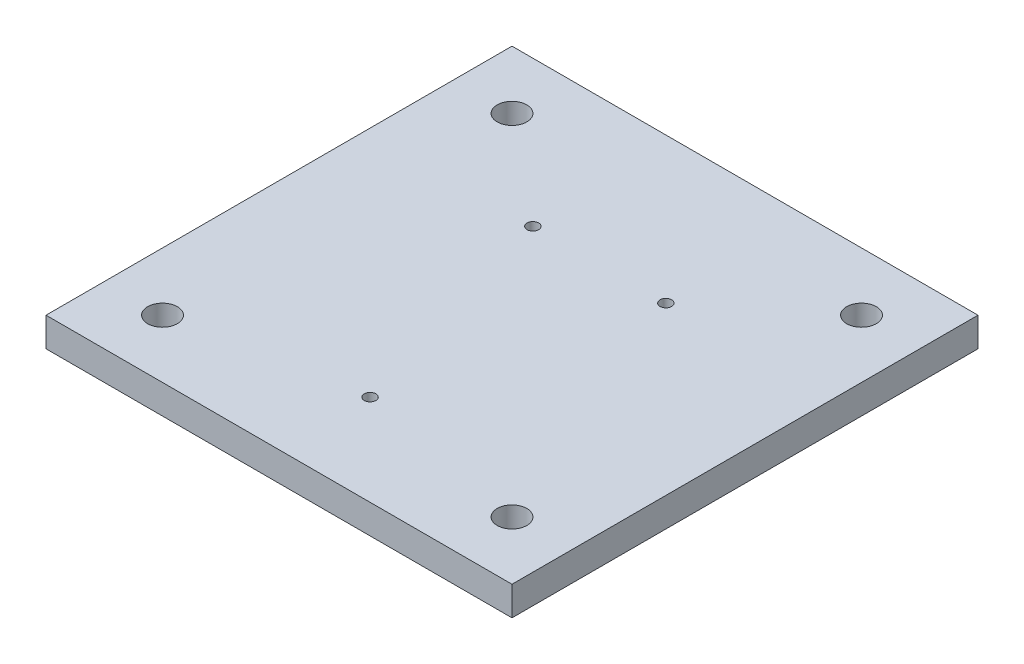
ISO-10303-21;
HEADER;
FILE_DESCRIPTION(('STEP AP214'),'2;1');
FILE_NAME('part.step','',(''),(''),'','','');
FILE_SCHEMA(('AUTOMOTIVE_DESIGN { 1 0 10303 214 1 1 1 1 }'));
ENDSEC;
DATA;
#1=APPLICATION_CONTEXT('core data for automotive mechanical design processes');
#2=APPLICATION_PROTOCOL_DEFINITION('international standard','automotive_design',2000,#1);
#3=PRODUCT_CONTEXT('',#1,'mechanical');
#4=PRODUCT('Part','Part','',(#3));
#5=PRODUCT_RELATED_PRODUCT_CATEGORY('part','',(#4));
#6=PRODUCT_DEFINITION_FORMATION('','',#4);
#7=PRODUCT_DEFINITION_CONTEXT('part definition',#1,'design');
#8=PRODUCT_DEFINITION('design','',#6,#7);
#9=PRODUCT_DEFINITION_SHAPE('','',#8);
#10=(LENGTH_UNIT() NAMED_UNIT(*) SI_UNIT(.MILLI.,.METRE.));
#11=(NAMED_UNIT(*) PLANE_ANGLE_UNIT() SI_UNIT($,.RADIAN.));
#12=(NAMED_UNIT(*) SI_UNIT($,.STERADIAN.) SOLID_ANGLE_UNIT());
#13=UNCERTAINTY_MEASURE_WITH_UNIT(LENGTH_MEASURE(1.E-05),#10,'distance_accuracy_value','');
#14=(GEOMETRIC_REPRESENTATION_CONTEXT(3) GLOBAL_UNCERTAINTY_ASSIGNED_CONTEXT((#13)) GLOBAL_UNIT_ASSIGNED_CONTEXT((#10,
#11,#12)) REPRESENTATION_CONTEXT('',''));
#15=CARTESIAN_POINT('',(0.,0.,0.));
#16=DIRECTION('',(0.,0.,1.));
#17=DIRECTION('',(1.,0.,0.));
#18=AXIS2_PLACEMENT_3D('',#15,#16,#17);
#19=CARTESIAN_POINT('',(0.,6.35,0.));
#20=DIRECTION('',(0.,1.,0.));
#21=DIRECTION('',(0.,0.,1.));
#22=AXIS2_PLACEMENT_3D('',#19,#20,#21);
#23=PLANE('',#22);
#24=CARTESIAN_POINT('',(38.1000000000008,6.35,38.1));
#25=DIRECTION('',(0.,1.,0.));
#26=DIRECTION('',(0.,0.,1.));
#27=AXIS2_PLACEMENT_3D('',#24,#25,#26);
#28=CIRCLE('',#27,3.22807216755905);
#29=CARTESIAN_POINT('',(38.1000000000008,6.35,41.3280721675591));
#30=VERTEX_POINT('',#29);
#31=EDGE_CURVE('E148',#30,#30,#28,.T.);
#32=ORIENTED_EDGE('',*,*,#31,.F.);
#33=EDGE_LOOP('',(#32));
#34=FACE_BOUND('',#33,.T.);
#35=CARTESIAN_POINT('',(-38.1,6.35,-38.1));
#36=DIRECTION('',(0.,1.,0.));
#37=DIRECTION('',(0.,0.,1.));
#38=AXIS2_PLACEMENT_3D('',#35,#36,#37);
#39=CIRCLE('',#38,3.22807216755905);
#40=CARTESIAN_POINT('',(-38.1,6.35,-34.8719278324409));
#41=VERTEX_POINT('',#40);
#42=EDGE_CURVE('E136',#41,#41,#39,.T.);
#43=ORIENTED_EDGE('',*,*,#42,.F.);
#44=EDGE_LOOP('',(#43));
#45=FACE_BOUND('',#44,.T.);
#46=CARTESIAN_POINT('',(14.5,6.35,-19.05));
#47=DIRECTION('',(0.,1.,0.));
#48=DIRECTION('',(0.,0.,1.));
#49=AXIS2_PLACEMENT_3D('',#46,#47,#48);
#50=CIRCLE('',#49,1.27);
#51=CARTESIAN_POINT('',(14.5,6.35,-17.78));
#52=VERTEX_POINT('',#51);
#53=EDGE_CURVE('E124',#52,#52,#50,.T.);
#54=ORIENTED_EDGE('',*,*,#53,.F.);
#55=EDGE_LOOP('',(#54));
#56=FACE_BOUND('',#55,.T.);
#57=DIRECTION('',(0.,0.,1.));
#58=VECTOR('',#57,1.);
#59=CARTESIAN_POINT('',(-50.8,6.35,50.8));
#60=LINE('',#59,#58);
#61=CARTESIAN_POINT('',(-50.8,6.35,-50.8));
#62=VERTEX_POINT('',#61);
#63=CARTESIAN_POINT('',(-50.8,6.35,50.8));
#64=VERTEX_POINT('',#63);
#65=EDGE_CURVE('E94',#62,#64,#60,.T.);
#66=ORIENTED_EDGE('',*,*,#65,.T.);
#67=DIRECTION('',(1.,0.,0.));
#68=VECTOR('',#67,1.);
#69=CARTESIAN_POINT('',(50.8,6.35,50.8));
#70=LINE('',#69,#68);
#71=CARTESIAN_POINT('',(50.8,6.35,50.8));
#72=VERTEX_POINT('',#71);
#73=EDGE_CURVE('E89',#64,#72,#70,.T.);
#74=ORIENTED_EDGE('',*,*,#73,.T.);
#75=DIRECTION('',(0.,0.,-1.));
#76=VECTOR('',#75,1.);
#77=CARTESIAN_POINT('',(50.8,6.35,50.8));
#78=LINE('',#77,#76);
#79=CARTESIAN_POINT('',(50.8,6.35,-50.8));
#80=VERTEX_POINT('',#79);
#81=EDGE_CURVE('E92',#72,#80,#78,.T.);
#82=ORIENTED_EDGE('',*,*,#81,.T.);
#83=DIRECTION('',(-1.,0.,0.));
#84=VECTOR('',#83,1.);
#85=CARTESIAN_POINT('',(50.8,6.35,-50.8));
#86=LINE('',#85,#84);
#87=EDGE_CURVE('E59',#80,#62,#86,.T.);
#88=ORIENTED_EDGE('',*,*,#87,.T.);
#89=EDGE_LOOP('',(#66,#74,#82,#88));
#90=FACE_BOUND('',#89,.T.);
#91=CARTESIAN_POINT('',(-14.5,6.35,-19.05));
#92=DIRECTION('',(0.,1.,0.));
#93=DIRECTION('',(0.,0.,1.));
#94=AXIS2_PLACEMENT_3D('',#91,#92,#93);
#95=CIRCLE('',#94,1.27);
#96=CARTESIAN_POINT('',(-14.5,6.35,-17.78));
#97=VERTEX_POINT('',#96);
#98=EDGE_CURVE('E109',#97,#97,#95,.T.);
#99=ORIENTED_EDGE('',*,*,#98,.F.);
#100=EDGE_LOOP('',(#99));
#101=FACE_BOUND('',#100,.T.);
#102=CARTESIAN_POINT('',(0.,6.35,30.95));
#103=DIRECTION('',(0.,1.,0.));
#104=DIRECTION('',(0.,0.,1.));
#105=AXIS2_PLACEMENT_3D('',#102,#103,#104);
#106=CIRCLE('',#105,1.27);
#107=CARTESIAN_POINT('',(0.,6.35,32.22));
#108=VERTEX_POINT('',#107);
#109=EDGE_CURVE('E130',#108,#108,#106,.T.);
#110=ORIENTED_EDGE('',*,*,#109,.F.);
#111=EDGE_LOOP('',(#110));
#112=FACE_BOUND('',#111,.T.);
#113=CARTESIAN_POINT('',(38.1,6.35,-38.1));
#114=DIRECTION('',(0.,1.,0.));
#115=DIRECTION('',(0.,0.,1.));
#116=AXIS2_PLACEMENT_3D('',#113,#114,#115);
#117=CIRCLE('',#116,3.22807216755905);
#118=CARTESIAN_POINT('',(38.1,6.35,-34.8719278324409));
#119=VERTEX_POINT('',#118);
#120=EDGE_CURVE('E142',#119,#119,#117,.T.);
#121=ORIENTED_EDGE('',*,*,#120,.F.);
#122=EDGE_LOOP('',(#121));
#123=FACE_BOUND('',#122,.T.);
#124=CARTESIAN_POINT('',(-38.0999999999992,6.35,38.1));
#125=DIRECTION('',(0.,1.,0.));
#126=DIRECTION('',(0.,0.,1.));
#127=AXIS2_PLACEMENT_3D('',#124,#125,#126);
#128=CIRCLE('',#127,3.22807216755905);
#129=CARTESIAN_POINT('',(-38.0999999999992,6.35,41.3280721675591));
#130=VERTEX_POINT('',#129);
#131=EDGE_CURVE('E154',#130,#130,#128,.T.);
#132=ORIENTED_EDGE('',*,*,#131,.F.);
#133=EDGE_LOOP('',(#132));
#134=FACE_BOUND('',#133,.T.);
#135=ADVANCED_FACE('F42',(#34,#45,#56,#90,#101,#112,#123,#134),#23,.T.);
#136=CARTESIAN_POINT('',(0.,0.,0.));
#137=DIRECTION('',(0.,1.,0.));
#138=DIRECTION('',(0.,0.,1.));
#139=AXIS2_PLACEMENT_3D('',#136,#137,#138);
#140=PLANE('',#139);
#141=DIRECTION('',(0.,0.,1.));
#142=VECTOR('',#141,1.);
#143=CARTESIAN_POINT('',(-50.8,0.,50.8));
#144=LINE('',#143,#142);
#145=CARTESIAN_POINT('',(-50.8,0.,-50.8));
#146=VERTEX_POINT('',#145);
#147=CARTESIAN_POINT('',(-50.8,0.,50.8));
#148=VERTEX_POINT('',#147);
#149=EDGE_CURVE('E106',#146,#148,#144,.T.);
#150=ORIENTED_EDGE('',*,*,#149,.F.);
#151=DIRECTION('',(-1.,0.,0.));
#152=VECTOR('',#151,1.);
#153=CARTESIAN_POINT('',(50.8,0.,-50.8));
#154=LINE('',#153,#152);
#155=CARTESIAN_POINT('',(50.8,0.,-50.8));
#156=VERTEX_POINT('',#155);
#157=EDGE_CURVE('E82',#156,#146,#154,.T.);
#158=ORIENTED_EDGE('',*,*,#157,.F.);
#159=DIRECTION('',(0.,0.,-1.));
#160=VECTOR('',#159,1.);
#161=CARTESIAN_POINT('',(50.8,0.,50.8));
#162=LINE('',#161,#160);
#163=CARTESIAN_POINT('',(50.8,0.,50.8));
#164=VERTEX_POINT('',#163);
#165=EDGE_CURVE('E76',#164,#156,#162,.T.);
#166=ORIENTED_EDGE('',*,*,#165,.F.);
#167=DIRECTION('',(1.,0.,0.));
#168=VECTOR('',#167,1.);
#169=CARTESIAN_POINT('',(50.8,0.,50.8));
#170=LINE('',#169,#168);
#171=EDGE_CURVE('E98',#148,#164,#170,.T.);
#172=ORIENTED_EDGE('',*,*,#171,.F.);
#173=EDGE_LOOP('',(#150,#158,#166,#172));
#174=FACE_BOUND('',#173,.T.);
#175=CARTESIAN_POINT('',(-14.5,0.,-19.05));
#176=DIRECTION('',(0.,1.,0.));
#177=DIRECTION('',(0.,0.,1.));
#178=AXIS2_PLACEMENT_3D('',#175,#176,#177);
#179=CIRCLE('',#178,1.27);
#180=CARTESIAN_POINT('',(-14.5,0.,-17.78));
#181=VERTEX_POINT('',#180);
#182=EDGE_CURVE('E121',#181,#181,#179,.T.);
#183=ORIENTED_EDGE('',*,*,#182,.T.);
#184=EDGE_LOOP('',(#183));
#185=FACE_BOUND('',#184,.T.);
#186=CARTESIAN_POINT('',(14.5,0.,-19.05));
#187=DIRECTION('',(0.,1.,0.));
#188=DIRECTION('',(0.,0.,1.));
#189=AXIS2_PLACEMENT_3D('',#186,#187,#188);
#190=CIRCLE('',#189,1.27);
#191=CARTESIAN_POINT('',(14.5,0.,-17.78));
#192=VERTEX_POINT('',#191);
#193=EDGE_CURVE('E127',#192,#192,#190,.T.);
#194=ORIENTED_EDGE('',*,*,#193,.T.);
#195=EDGE_LOOP('',(#194));
#196=FACE_BOUND('',#195,.T.);
#197=CARTESIAN_POINT('',(0.,0.,30.95));
#198=DIRECTION('',(0.,1.,0.));
#199=DIRECTION('',(0.,0.,1.));
#200=AXIS2_PLACEMENT_3D('',#197,#198,#199);
#201=CIRCLE('',#200,1.27);
#202=CARTESIAN_POINT('',(0.,0.,32.22));
#203=VERTEX_POINT('',#202);
#204=EDGE_CURVE('E133',#203,#203,#201,.T.);
#205=ORIENTED_EDGE('',*,*,#204,.T.);
#206=EDGE_LOOP('',(#205));
#207=FACE_BOUND('',#206,.T.);
#208=CARTESIAN_POINT('',(-38.1,0.,-38.1));
#209=DIRECTION('',(0.,1.,0.));
#210=DIRECTION('',(0.,0.,1.));
#211=AXIS2_PLACEMENT_3D('',#208,#209,#210);
#212=CIRCLE('',#211,3.22807216755905);
#213=CARTESIAN_POINT('',(-38.1,0.,-34.8719278324409));
#214=VERTEX_POINT('',#213);
#215=EDGE_CURVE('E139',#214,#214,#212,.T.);
#216=ORIENTED_EDGE('',*,*,#215,.T.);
#217=EDGE_LOOP('',(#216));
#218=FACE_BOUND('',#217,.T.);
#219=CARTESIAN_POINT('',(38.1,0.,-38.1));
#220=DIRECTION('',(0.,1.,0.));
#221=DIRECTION('',(0.,0.,1.));
#222=AXIS2_PLACEMENT_3D('',#219,#220,#221);
#223=CIRCLE('',#222,3.22807216755905);
#224=CARTESIAN_POINT('',(38.1,0.,-34.8719278324409));
#225=VERTEX_POINT('',#224);
#226=EDGE_CURVE('E145',#225,#225,#223,.T.);
#227=ORIENTED_EDGE('',*,*,#226,.T.);
#228=EDGE_LOOP('',(#227));
#229=FACE_BOUND('',#228,.T.);
#230=CARTESIAN_POINT('',(38.1000000000008,0.,38.1));
#231=DIRECTION('',(0.,1.,0.));
#232=DIRECTION('',(0.,0.,1.));
#233=AXIS2_PLACEMENT_3D('',#230,#231,#232);
#234=CIRCLE('',#233,3.22807216755905);
#235=CARTESIAN_POINT('',(38.1000000000008,0.,41.3280721675591));
#236=VERTEX_POINT('',#235);
#237=EDGE_CURVE('E151',#236,#236,#234,.T.);
#238=ORIENTED_EDGE('',*,*,#237,.T.);
#239=EDGE_LOOP('',(#238));
#240=FACE_BOUND('',#239,.T.);
#241=CARTESIAN_POINT('',(-38.0999999999992,0.,38.1));
#242=DIRECTION('',(0.,1.,0.));
#243=DIRECTION('',(0.,0.,1.));
#244=AXIS2_PLACEMENT_3D('',#241,#242,#243);
#245=CIRCLE('',#244,3.22807216755905);
#246=CARTESIAN_POINT('',(-38.0999999999992,0.,41.3280721675591));
#247=VERTEX_POINT('',#246);
#248=EDGE_CURVE('E157',#247,#247,#245,.T.);
#249=ORIENTED_EDGE('',*,*,#248,.T.);
#250=EDGE_LOOP('',(#249));
#251=FACE_BOUND('',#250,.T.);
#252=ADVANCED_FACE('F117',(#174,#185,#196,#207,#218,#229,#240,#251),#140,.F.);
#253=CARTESIAN_POINT('',(-50.8,6.35,50.8));
#254=DIRECTION('',(1.,0.,0.));
#255=DIRECTION('',(0.,0.,-1.));
#256=AXIS2_PLACEMENT_3D('',#253,#254,#255);
#257=PLANE('',#256);
#258=ORIENTED_EDGE('',*,*,#149,.T.);
#259=DIRECTION('',(0.,-1.,0.));
#260=VECTOR('',#259,1.);
#261=CARTESIAN_POINT('',(-50.8,6.35,50.8));
#262=LINE('',#261,#260);
#263=EDGE_CURVE('E13',#64,#148,#262,.T.);
#264=ORIENTED_EDGE('',*,*,#263,.F.);
#265=ORIENTED_EDGE('',*,*,#65,.F.);
#266=DIRECTION('',(0.,-1.,0.));
#267=VECTOR('',#266,1.);
#268=CARTESIAN_POINT('',(-50.8,6.35,-50.8));
#269=LINE('',#268,#267);
#270=EDGE_CURVE('E102',#62,#146,#269,.T.);
#271=ORIENTED_EDGE('',*,*,#270,.T.);
#272=EDGE_LOOP('',(#258,#264,#265,#271));
#273=FACE_BOUND('',#272,.T.);
#274=ADVANCED_FACE('F44',(#273),#257,.F.);
#275=CARTESIAN_POINT('',(50.8,6.35,50.8));
#276=DIRECTION('',(0.,0.,-1.));
#277=DIRECTION('',(-1.,0.,0.));
#278=AXIS2_PLACEMENT_3D('',#275,#276,#277);
#279=PLANE('',#278);
#280=ORIENTED_EDGE('',*,*,#171,.T.);
#281=DIRECTION('',(0.,-1.,0.));
#282=VECTOR('',#281,1.);
#283=CARTESIAN_POINT('',(50.8,6.35,50.8));
#284=LINE('',#283,#282);
#285=EDGE_CURVE('E51',#72,#164,#284,.T.);
#286=ORIENTED_EDGE('',*,*,#285,.F.);
#287=ORIENTED_EDGE('',*,*,#73,.F.);
#288=ORIENTED_EDGE('',*,*,#263,.T.);
#289=EDGE_LOOP('',(#280,#286,#287,#288));
#290=FACE_BOUND('',#289,.T.);
#291=ADVANCED_FACE('F97',(#290),#279,.F.);
#292=CARTESIAN_POINT('',(50.8,6.35,50.8));
#293=DIRECTION('',(-1.,0.,0.));
#294=DIRECTION('',(0.,0.,1.));
#295=AXIS2_PLACEMENT_3D('',#292,#293,#294);
#296=PLANE('',#295);
#297=ORIENTED_EDGE('',*,*,#165,.T.);
#298=DIRECTION('',(0.,-1.,0.));
#299=VECTOR('',#298,1.);
#300=CARTESIAN_POINT('',(50.8,6.35,-50.8));
#301=LINE('',#300,#299);
#302=EDGE_CURVE('E99',#80,#156,#301,.T.);
#303=ORIENTED_EDGE('',*,*,#302,.F.);
#304=ORIENTED_EDGE('',*,*,#81,.F.);
#305=ORIENTED_EDGE('',*,*,#285,.T.);
#306=EDGE_LOOP('',(#297,#303,#304,#305));
#307=FACE_BOUND('',#306,.T.);
#308=ADVANCED_FACE('F100',(#307),#296,.F.);
#309=CARTESIAN_POINT('',(50.8,6.35,-50.8));
#310=DIRECTION('',(0.,0.,1.));
#311=DIRECTION('',(1.,0.,0.));
#312=AXIS2_PLACEMENT_3D('',#309,#310,#311);
#313=PLANE('',#312);
#314=ORIENTED_EDGE('',*,*,#157,.T.);
#315=ORIENTED_EDGE('',*,*,#270,.F.);
#316=ORIENTED_EDGE('',*,*,#87,.F.);
#317=ORIENTED_EDGE('',*,*,#302,.T.);
#318=EDGE_LOOP('',(#314,#315,#316,#317));
#319=FACE_BOUND('',#318,.T.);
#320=ADVANCED_FACE('F114',(#319),#313,.F.);
#321=CARTESIAN_POINT('',(-14.5,6.35,-19.05));
#322=DIRECTION('',(0.,-1.,0.));
#323=DIRECTION('',(0.,0.,-1.));
#324=AXIS2_PLACEMENT_3D('',#321,#322,#323);
#325=CYLINDRICAL_SURFACE('',#324,1.27);
#326=ORIENTED_EDGE('',*,*,#98,.T.);
#327=EDGE_LOOP('',(#326));
#328=FACE_BOUND('',#327,.T.);
#329=ORIENTED_EDGE('',*,*,#182,.F.);
#330=EDGE_LOOP('',(#329));
#331=FACE_BOUND('',#330,.T.);
#332=ADVANCED_FACE('F176',(#328,#331),#325,.F.);
#333=CARTESIAN_POINT('',(14.5,6.35,-19.05));
#334=DIRECTION('',(0.,-1.,0.));
#335=DIRECTION('',(0.,0.,-1.));
#336=AXIS2_PLACEMENT_3D('',#333,#334,#335);
#337=CYLINDRICAL_SURFACE('',#336,1.27);
#338=ORIENTED_EDGE('',*,*,#53,.T.);
#339=EDGE_LOOP('',(#338));
#340=FACE_BOUND('',#339,.T.);
#341=ORIENTED_EDGE('',*,*,#193,.F.);
#342=EDGE_LOOP('',(#341));
#343=FACE_BOUND('',#342,.T.);
#344=ADVANCED_FACE('F211',(#340,#343),#337,.F.);
#345=CARTESIAN_POINT('',(0.,6.35,30.95));
#346=DIRECTION('',(0.,-1.,0.));
#347=DIRECTION('',(0.,0.,-1.));
#348=AXIS2_PLACEMENT_3D('',#345,#346,#347);
#349=CYLINDRICAL_SURFACE('',#348,1.27);
#350=ORIENTED_EDGE('',*,*,#109,.T.);
#351=EDGE_LOOP('',(#350));
#352=FACE_BOUND('',#351,.T.);
#353=ORIENTED_EDGE('',*,*,#204,.F.);
#354=EDGE_LOOP('',(#353));
#355=FACE_BOUND('',#354,.T.);
#356=ADVANCED_FACE('F218',(#352,#355),#349,.F.);
#357=CARTESIAN_POINT('',(-38.1,6.35,-38.1));
#358=DIRECTION('',(0.,-1.,0.));
#359=DIRECTION('',(0.,0.,-1.));
#360=AXIS2_PLACEMENT_3D('',#357,#358,#359);
#361=CYLINDRICAL_SURFACE('',#360,3.22807216755905);
#362=ORIENTED_EDGE('',*,*,#42,.T.);
#363=EDGE_LOOP('',(#362));
#364=FACE_BOUND('',#363,.T.);
#365=ORIENTED_EDGE('',*,*,#215,.F.);
#366=EDGE_LOOP('',(#365));
#367=FACE_BOUND('',#366,.T.);
#368=ADVANCED_FACE('F225',(#364,#367),#361,.F.);
#369=CARTESIAN_POINT('',(38.1,6.35,-38.1));
#370=DIRECTION('',(0.,-1.,0.));
#371=DIRECTION('',(0.,0.,-1.));
#372=AXIS2_PLACEMENT_3D('',#369,#370,#371);
#373=CYLINDRICAL_SURFACE('',#372,3.22807216755905);
#374=ORIENTED_EDGE('',*,*,#120,.T.);
#375=EDGE_LOOP('',(#374));
#376=FACE_BOUND('',#375,.T.);
#377=ORIENTED_EDGE('',*,*,#226,.F.);
#378=EDGE_LOOP('',(#377));
#379=FACE_BOUND('',#378,.T.);
#380=ADVANCED_FACE('F233',(#376,#379),#373,.F.);
#381=CARTESIAN_POINT('',(38.1000000000008,6.35,38.1));
#382=DIRECTION('',(0.,-1.,0.));
#383=DIRECTION('',(0.,0.,-1.));
#384=AXIS2_PLACEMENT_3D('',#381,#382,#383);
#385=CYLINDRICAL_SURFACE('',#384,3.22807216755905);
#386=ORIENTED_EDGE('',*,*,#31,.T.);
#387=EDGE_LOOP('',(#386));
#388=FACE_BOUND('',#387,.T.);
#389=ORIENTED_EDGE('',*,*,#237,.F.);
#390=EDGE_LOOP('',(#389));
#391=FACE_BOUND('',#390,.T.);
#392=ADVANCED_FACE('F241',(#388,#391),#385,.F.);
#393=CARTESIAN_POINT('',(-38.0999999999992,6.35,38.1));
#394=DIRECTION('',(0.,-1.,0.));
#395=DIRECTION('',(0.,0.,-1.));
#396=AXIS2_PLACEMENT_3D('',#393,#394,#395);
#397=CYLINDRICAL_SURFACE('',#396,3.22807216755905);
#398=ORIENTED_EDGE('',*,*,#131,.T.);
#399=EDGE_LOOP('',(#398));
#400=FACE_BOUND('',#399,.T.);
#401=ORIENTED_EDGE('',*,*,#248,.F.);
#402=EDGE_LOOP('',(#401));
#403=FACE_BOUND('',#402,.T.);
#404=ADVANCED_FACE('F163',(#400,#403),#397,.F.);
#405=CLOSED_SHELL('',(#135,#252,#274,#291,#308,#320,#332,#344,#356,#368,#380,#392,#404));
#406=MANIFOLD_SOLID_BREP('B2',#405);
#407=ADVANCED_BREP_SHAPE_REPRESENTATION('',(#18,#406),#14);
#408=SHAPE_DEFINITION_REPRESENTATION(#9,#407);
ENDSEC;
END-ISO-10303-21;
